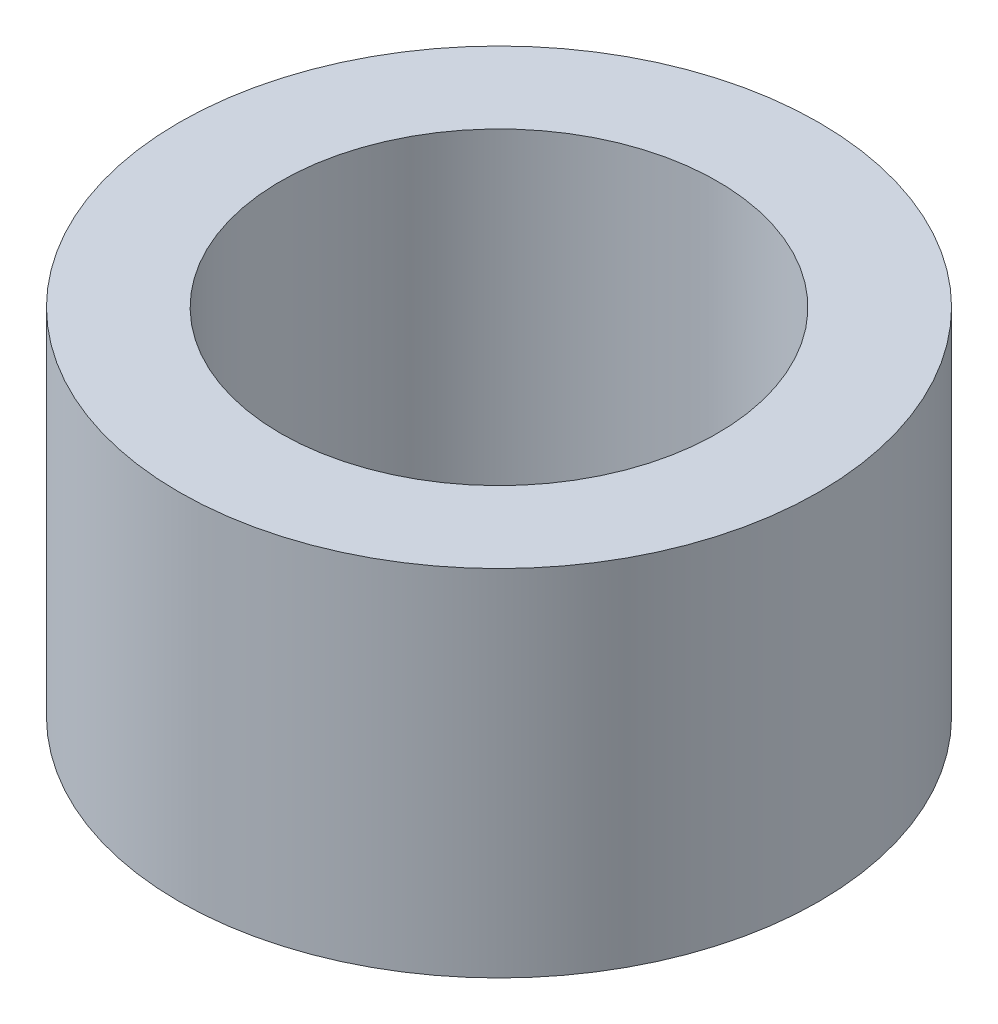
ISO-10303-21;
HEADER;
FILE_DESCRIPTION(('STEP AP214'),'2;1');
FILE_NAME('part.step','',(''),(''),'','','');
FILE_SCHEMA(('AUTOMOTIVE_DESIGN { 1 0 10303 214 1 1 1 1 }'));
ENDSEC;
DATA;
#1=APPLICATION_CONTEXT('core data for automotive mechanical design processes');
#2=APPLICATION_PROTOCOL_DEFINITION('international standard','automotive_design',2000,#1);
#3=PRODUCT_CONTEXT('',#1,'mechanical');
#4=PRODUCT('Part','Part','',(#3));
#5=PRODUCT_RELATED_PRODUCT_CATEGORY('part','',(#4));
#6=PRODUCT_DEFINITION_FORMATION('','',#4);
#7=PRODUCT_DEFINITION_CONTEXT('part definition',#1,'design');
#8=PRODUCT_DEFINITION('design','',#6,#7);
#9=PRODUCT_DEFINITION_SHAPE('','',#8);
#10=(LENGTH_UNIT() NAMED_UNIT(*) SI_UNIT(.MILLI.,.METRE.));
#11=(NAMED_UNIT(*) PLANE_ANGLE_UNIT() SI_UNIT($,.RADIAN.));
#12=(NAMED_UNIT(*) SI_UNIT($,.STERADIAN.) SOLID_ANGLE_UNIT());
#13=UNCERTAINTY_MEASURE_WITH_UNIT(LENGTH_MEASURE(1.E-05),#10,'distance_accuracy_value','');
#14=(GEOMETRIC_REPRESENTATION_CONTEXT(3) GLOBAL_UNCERTAINTY_ASSIGNED_CONTEXT((#13)) GLOBAL_UNIT_ASSIGNED_CONTEXT((#10,
#11,#12)) REPRESENTATION_CONTEXT('',''));
#15=CARTESIAN_POINT('',(0.,0.,0.));
#16=DIRECTION('',(0.,0.,1.));
#17=DIRECTION('',(1.,0.,0.));
#18=AXIS2_PLACEMENT_3D('',#15,#16,#17);
#19=CARTESIAN_POINT('',(0.,8.86444238707559,0.));
#20=DIRECTION('',(0.,-1.,0.));
#21=DIRECTION('',(0.,0.,-1.));
#22=AXIS2_PLACEMENT_3D('',#19,#20,#21);
#23=CYLINDRICAL_SURFACE('',#22,8.001);
#24=CARTESIAN_POINT('',(0.,8.86444238707559,0.));
#25=DIRECTION('',(0.,1.,0.));
#26=DIRECTION('',(0.,0.,1.));
#27=AXIS2_PLACEMENT_3D('',#24,#25,#26);
#28=CIRCLE('',#27,8.001);
#29=CARTESIAN_POINT('',(0.,8.86444238707559,8.001));
#30=VERTEX_POINT('',#29);
#31=EDGE_CURVE('E11',#30,#30,#28,.T.);
#32=ORIENTED_EDGE('',*,*,#31,.F.);
#33=EDGE_LOOP('',(#32));
#34=FACE_BOUND('',#33,.T.);
#35=CARTESIAN_POINT('',(0.,0.,0.));
#36=DIRECTION('',(0.,1.,0.));
#37=DIRECTION('',(-1.,0.,0.));
#38=AXIS2_PLACEMENT_3D('',#35,#36,#37);
#39=CIRCLE('',#38,8.001);
#40=CARTESIAN_POINT('',(-8.001,0.,0.));
#41=VERTEX_POINT('',#40);
#42=EDGE_CURVE('E49',#41,#41,#39,.T.);
#43=ORIENTED_EDGE('',*,*,#42,.T.);
#44=EDGE_LOOP('',(#43));
#45=FACE_BOUND('',#44,.T.);
#46=ADVANCED_FACE('F43',(#34,#45),#23,.T.);
#47=CARTESIAN_POINT('',(0.,8.86444238707559,0.));
#48=DIRECTION('',(0.,1.,0.));
#49=DIRECTION('',(0.,0.,1.));
#50=AXIS2_PLACEMENT_3D('',#47,#48,#49);
#51=PLANE('',#50);
#52=CARTESIAN_POINT('',(0.,8.86444238707559,0.));
#53=DIRECTION('',(0.,1.,0.));
#54=DIRECTION('',(0.,0.,1.));
#55=AXIS2_PLACEMENT_3D('',#52,#53,#54);
#56=CIRCLE('',#55,5.461);
#57=CARTESIAN_POINT('',(0.,8.86444238707559,5.461));
#58=VERTEX_POINT('',#57);
#59=EDGE_CURVE('E76',#58,#58,#56,.T.);
#60=ORIENTED_EDGE('',*,*,#59,.F.);
#61=EDGE_LOOP('',(#60));
#62=FACE_BOUND('',#61,.T.);
#63=ORIENTED_EDGE('',*,*,#31,.T.);
#64=EDGE_LOOP('',(#63));
#65=FACE_BOUND('',#64,.T.);
#66=ADVANCED_FACE('F55',(#62,#65),#51,.T.);
#67=CARTESIAN_POINT('',(0.,-3.13555761292435,0.));
#68=DIRECTION('',(0.,1.,0.));
#69=DIRECTION('',(-1.,0.,0.));
#70=AXIS2_PLACEMENT_3D('',#67,#68,#69);
#71=CONICAL_SURFACE('',#70,0.,1.19729586686812);
#72=ORIENTED_EDGE('',*,*,#42,.F.);
#73=EDGE_LOOP('',(#72));
#74=FACE_BOUND('',#73,.T.);
#75=CARTESIAN_POINT('',(0.,-3.13555761292435,0.));
#76=VERTEX_POINT('',#75);
#77=VERTEX_LOOP('',#76);
#78=FACE_BOUND('',#77,.T.);
#79=ADVANCED_FACE('F52',(#74,#78),#71,.T.);
#80=CARTESIAN_POINT('',(0.,-0.595557612924407,0.));
#81=DIRECTION('',(0.,1.,0.));
#82=DIRECTION('',(0.,0.,1.));
#83=AXIS2_PLACEMENT_3D('',#80,#81,#82);
#84=CYLINDRICAL_SURFACE('',#83,5.461);
#85=CARTESIAN_POINT('',(0.,-0.595557612924407,0.));
#86=DIRECTION('',(0.,1.,0.));
#87=DIRECTION('',(0.,0.,1.));
#88=AXIS2_PLACEMENT_3D('',#85,#86,#87);
#89=CIRCLE('',#88,5.461);
#90=CARTESIAN_POINT('',(0.,-0.595557612924407,5.461));
#91=VERTEX_POINT('',#90);
#92=EDGE_CURVE('E74',#91,#91,#89,.T.);
#93=CARTESIAN_POINT('',(0.,-0.595557612924407,5.461));
#94=CARTESIAN_POINT('',(0.,-0.497015946257741,5.461));
#95=CARTESIAN_POINT('',(0.,-0.398474279591074,5.461));
#96=CARTESIAN_POINT('',(0.,-0.201390946257741,5.461));
#97=CARTESIAN_POINT('',(0.,-0.102849279591074,5.461));
#98=CARTESIAN_POINT('',(0.,0.0942340537422593,5.461));
#99=CARTESIAN_POINT('',(0.,0.192775720408926,5.461));
#100=CARTESIAN_POINT('',(0.,0.389859053742259,5.461));
#101=CARTESIAN_POINT('',(0.,0.488400720408926,5.461));
#102=CARTESIAN_POINT('',(0.,0.685484053742259,5.461));
#103=CARTESIAN_POINT('',(0.,0.784025720408926,5.461));
#104=CARTESIAN_POINT('',(0.,0.98110905374226,5.461));
#105=CARTESIAN_POINT('',(0.,1.07965072040893,5.461));
#106=CARTESIAN_POINT('',(0.,1.27673405374226,5.461));
#107=CARTESIAN_POINT('',(0.,1.37527572040893,5.461));
#108=CARTESIAN_POINT('',(0.,1.57235905374226,5.461));
#109=CARTESIAN_POINT('',(0.,1.67090072040893,5.461));
#110=CARTESIAN_POINT('',(0.,1.86798405374226,5.461));
#111=CARTESIAN_POINT('',(0.,1.96652572040893,5.461));
#112=CARTESIAN_POINT('',(0.,2.16360905374226,5.461));
#113=CARTESIAN_POINT('',(0.,2.26215072040893,5.461));
#114=CARTESIAN_POINT('',(0.,2.45923405374226,5.461));
#115=CARTESIAN_POINT('',(0.,2.55777572040893,5.461));
#116=CARTESIAN_POINT('',(0.,2.75485905374226,5.461));
#117=CARTESIAN_POINT('',(0.,2.85340072040893,5.461));
#118=CARTESIAN_POINT('',(0.,3.05048405374226,5.461));
#119=CARTESIAN_POINT('',(0.,3.14902572040893,5.461));
#120=CARTESIAN_POINT('',(0.,3.34610905374226,5.461));
#121=CARTESIAN_POINT('',(0.,3.44465072040893,5.461));
#122=CARTESIAN_POINT('',(0.,3.64173405374226,5.461));
#123=CARTESIAN_POINT('',(0.,3.74027572040893,5.461));
#124=CARTESIAN_POINT('',(0.,3.93735905374226,5.461));
#125=CARTESIAN_POINT('',(0.,4.03590072040893,5.461));
#126=CARTESIAN_POINT('',(0.,4.23298405374226,5.461));
#127=CARTESIAN_POINT('',(0.,4.33152572040893,5.461));
#128=CARTESIAN_POINT('',(0.,4.52860905374226,5.461));
#129=CARTESIAN_POINT('',(0.,4.62715072040893,5.461));
#130=CARTESIAN_POINT('',(0.,4.82423405374226,5.461));
#131=CARTESIAN_POINT('',(0.,4.92277572040893,5.461));
#132=CARTESIAN_POINT('',(0.,5.11985905374226,5.461));
#133=CARTESIAN_POINT('',(0.,5.21840072040893,5.461));
#134=CARTESIAN_POINT('',(0.,5.41548405374226,5.461));
#135=CARTESIAN_POINT('',(0.,5.51402572040893,5.461));
#136=CARTESIAN_POINT('',(0.,5.71110905374226,5.461));
#137=CARTESIAN_POINT('',(0.,5.80965072040893,5.461));
#138=CARTESIAN_POINT('',(0.,6.00673405374226,5.461));
#139=CARTESIAN_POINT('',(0.,6.10527572040893,5.461));
#140=CARTESIAN_POINT('',(0.,6.30235905374226,5.461));
#141=CARTESIAN_POINT('',(0.,6.40090072040893,5.461));
#142=CARTESIAN_POINT('',(0.,6.59798405374226,5.461));
#143=CARTESIAN_POINT('',(0.,6.69652572040893,5.461));
#144=CARTESIAN_POINT('',(0.,6.89360905374226,5.461));
#145=CARTESIAN_POINT('',(0.,6.99215072040893,5.461));
#146=CARTESIAN_POINT('',(0.,7.18923405374226,5.461));
#147=CARTESIAN_POINT('',(0.,7.28777572040893,5.461));
#148=CARTESIAN_POINT('',(0.,7.48485905374226,5.461));
#149=CARTESIAN_POINT('',(0.,7.58340072040893,5.461));
#150=CARTESIAN_POINT('',(0.,7.78048405374226,5.461));
#151=CARTESIAN_POINT('',(0.,7.87902572040893,5.461));
#152=CARTESIAN_POINT('',(0.,8.07610905374226,5.461));
#153=CARTESIAN_POINT('',(0.,8.17465072040893,5.461));
#154=CARTESIAN_POINT('',(0.,8.37173405374226,5.461));
#155=CARTESIAN_POINT('',(0.,8.47027572040893,5.461));
#156=CARTESIAN_POINT('',(0.,8.66735905374226,5.461));
#157=CARTESIAN_POINT('',(0.,8.76590072040893,5.461));
#158=CARTESIAN_POINT('',(0.,8.86444238707559,5.461));
#159=B_SPLINE_CURVE_WITH_KNOTS('',3,(#93,#94,#95,#96,#97,#98,#99,#100,#101,#102,#103,#104,#105,
#106,#107,#108,#109,#110,#111,#112,#113,#114,#115,#116,#117,#118,#119,#120,#121,#122,#123,#124,
#125,#126,#127,#128,#129,#130,#131,#132,#133,#134,#135,#136,#137,#138,#139,#140,#141,#142,#143,
#144,#145,#146,#147,#148,#149,#150,#151,#152,#153,#154,#155,#156,#157,#158),.UNSPECIFIED.,.F.,
.F.,(4,2,2,2,2,2,2,2,2,2,2,2,2,2,2,2,2,2,2,2,2,2,2,2,2,2,2,2,2,2,2,2,4),(0.,0.295625,0.59125,
0.886875,1.1825,1.478125,1.77375,2.069375,2.365,2.660625,2.95625,3.251875,3.5475,3.843125,
4.13875,4.434375,4.73,5.025625,5.32125,5.616875,5.9125,6.208125,6.50375,6.799375,7.095,7.390625,
7.68625,7.981875,8.2775,8.573125,8.86875,9.164375,9.46),.UNSPECIFIED.);
#160=EDGE_CURVE('BSEAM54',#91,#58,#159,.T.);
#161=ORIENTED_EDGE('',*,*,#92,.F.);
#162=ORIENTED_EDGE('',*,*,#59,.T.);
#163=ORIENTED_EDGE('',*,*,#160,.T.);
#164=ORIENTED_EDGE('',*,*,#160,.F.);
#165=EDGE_LOOP('',(#161,#163,#162,#164));
#166=FACE_BOUND('',#165,.T.);
#167=ADVANCED_FACE('F54',(#166),#84,.F.);
#168=CARTESIAN_POINT('',(0.,-0.595557612924407,0.));
#169=DIRECTION('',(0.,1.,0.));
#170=DIRECTION('',(0.,0.,1.));
#171=AXIS2_PLACEMENT_3D('',#168,#169,#170);
#172=PLANE('',#171);
#173=ORIENTED_EDGE('',*,*,#92,.T.);
#174=EDGE_LOOP('',(#173));
#175=FACE_BOUND('',#174,.T.);
#176=ADVANCED_FACE('F63',(#175),#172,.T.);
#177=CLOSED_SHELL('',(#46,#66,#79,#167,#176));
#178=MANIFOLD_SOLID_BREP('B2',#177);
#179=ADVANCED_BREP_SHAPE_REPRESENTATION('',(#18,#178),#14);
#180=SHAPE_DEFINITION_REPRESENTATION(#9,#179);
ENDSEC;
END-ISO-10303-21;
